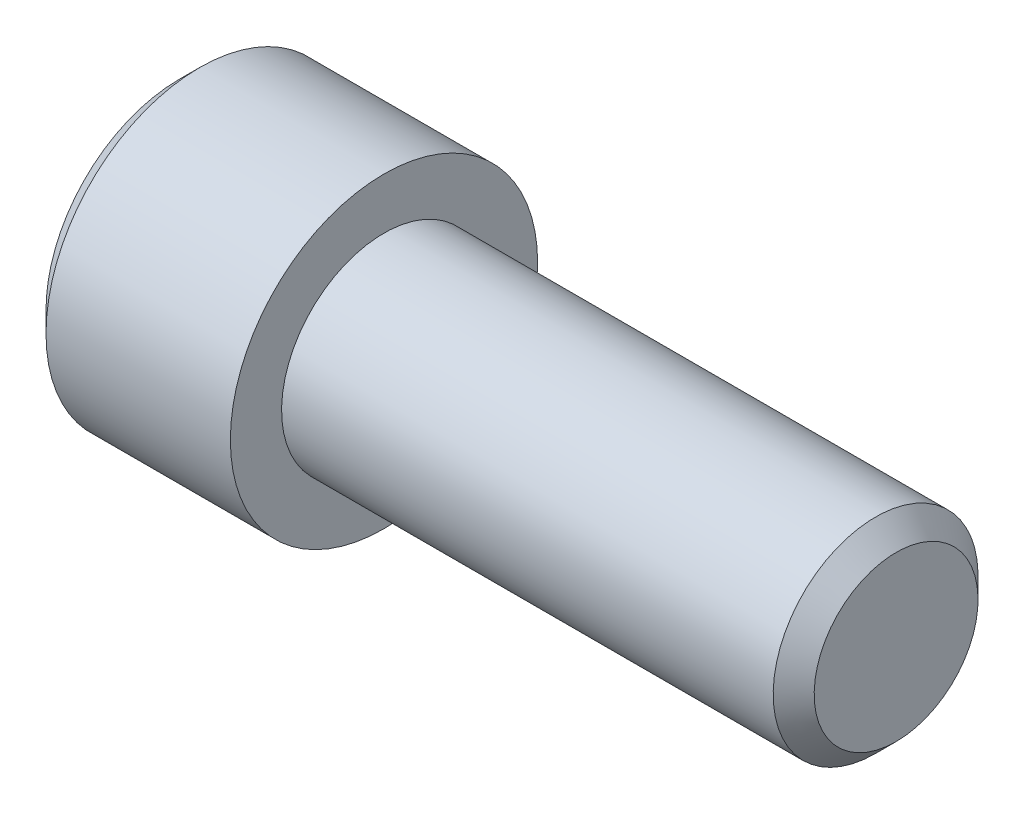
ISO-10303-21;
HEADER;
FILE_DESCRIPTION(('STEP AP214'),'2;1');
FILE_NAME('part.step','',(''),(''),'','','');
FILE_SCHEMA(('AUTOMOTIVE_DESIGN { 1 0 10303 214 1 1 1 1 }'));
ENDSEC;
DATA;
#1=APPLICATION_CONTEXT('core data for automotive mechanical design processes');
#2=APPLICATION_PROTOCOL_DEFINITION('international standard','automotive_design',2000,#1);
#3=PRODUCT_CONTEXT('',#1,'mechanical');
#4=PRODUCT('Part','Part','',(#3));
#5=PRODUCT_RELATED_PRODUCT_CATEGORY('part','',(#4));
#6=PRODUCT_DEFINITION_FORMATION('','',#4);
#7=PRODUCT_DEFINITION_CONTEXT('part definition',#1,'design');
#8=PRODUCT_DEFINITION('design','',#6,#7);
#9=PRODUCT_DEFINITION_SHAPE('','',#8);
#10=(LENGTH_UNIT() NAMED_UNIT(*) SI_UNIT(.MILLI.,.METRE.));
#11=(NAMED_UNIT(*) PLANE_ANGLE_UNIT() SI_UNIT($,.RADIAN.));
#12=(NAMED_UNIT(*) SI_UNIT($,.STERADIAN.) SOLID_ANGLE_UNIT());
#13=UNCERTAINTY_MEASURE_WITH_UNIT(LENGTH_MEASURE(1.E-05),#10,'distance_accuracy_value','');
#14=(GEOMETRIC_REPRESENTATION_CONTEXT(3) GLOBAL_UNCERTAINTY_ASSIGNED_CONTEXT((#13)) GLOBAL_UNIT_ASSIGNED_CONTEXT((#10,
#11,#12)) REPRESENTATION_CONTEXT('',''));
#15=CARTESIAN_POINT('',(0.,0.,0.));
#16=DIRECTION('',(0.,0.,1.));
#17=DIRECTION('',(1.,0.,0.));
#18=AXIS2_PLACEMENT_3D('',#15,#16,#17);
#19=CARTESIAN_POINT('',(-12.,0.,0.));
#20=DIRECTION('',(1.,0.,0.));
#21=DIRECTION('',(0.,1.,0.));
#22=AXIS2_PLACEMENT_3D('',#19,#20,#21);
#23=PLANE('',#22);
#24=CARTESIAN_POINT('',(-12.,0.,0.));
#25=DIRECTION('',(1.,0.,0.));
#26=DIRECTION('',(0.,1.,0.));
#27=AXIS2_PLACEMENT_3D('',#24,#25,#26);
#28=CIRCLE('',#27,7.8);
#29=CARTESIAN_POINT('',(-12.,7.8,0.));
#30=VERTEX_POINT('',#29);
#31=EDGE_CURVE('E44',#30,#30,#28,.F.);
#32=ORIENTED_EDGE('',*,*,#31,.T.);
#33=EDGE_LOOP('',(#32));
#34=FACE_BOUND('',#33,.T.);
#35=DIRECTION('',(0.,0.500000000000001,0.866025403784438));
#36=VECTOR('',#35,1.);
#37=CARTESIAN_POINT('',(-12.,-5.7735026918963,0.));
#38=LINE('',#37,#36);
#39=CARTESIAN_POINT('',(-12.,-5.7735026918963,0.));
#40=VERTEX_POINT('',#39);
#41=CARTESIAN_POINT('',(-12.,-2.88675134594814,5.00000000000004));
#42=VERTEX_POINT('',#41);
#43=EDGE_CURVE('E124',#40,#42,#38,.T.);
#44=ORIENTED_EDGE('',*,*,#43,.F.);
#45=DIRECTION('',(0.,-0.499999999999995,0.866025403784441));
#46=VECTOR('',#45,1.);
#47=CARTESIAN_POINT('',(-12.,-2.88675134594821,-5.));
#48=LINE('',#47,#46);
#49=CARTESIAN_POINT('',(-12.,-2.88675134594821,-5.));
#50=VERTEX_POINT('',#49);
#51=EDGE_CURVE('E51',#50,#40,#48,.T.);
#52=ORIENTED_EDGE('',*,*,#51,.F.);
#53=DIRECTION('',(0.,-1.,0.));
#54=VECTOR('',#53,1.);
#55=CARTESIAN_POINT('',(-12.,2.8867513459481,-5.00000000000006));
#56=LINE('',#55,#54);
#57=CARTESIAN_POINT('',(-12.,2.8867513459481,-5.00000000000006));
#58=VERTEX_POINT('',#57);
#59=EDGE_CURVE('E110',#58,#50,#56,.T.);
#60=ORIENTED_EDGE('',*,*,#59,.F.);
#61=DIRECTION('',(0.,-0.500000000000007,-0.866025403784435));
#62=VECTOR('',#61,1.);
#63=CARTESIAN_POINT('',(-12.,5.7735026918963,0.));
#64=LINE('',#63,#62);
#65=CARTESIAN_POINT('',(-12.,5.7735026918963,0.));
#66=VERTEX_POINT('',#65);
#67=EDGE_CURVE('E113',#66,#58,#64,.T.);
#68=ORIENTED_EDGE('',*,*,#67,.F.);
#69=DIRECTION('',(0.,0.499999999999995,-0.866025403784441));
#70=VECTOR('',#69,1.);
#71=CARTESIAN_POINT('',(-12.,2.88675134594817,5.00000000000002));
#72=LINE('',#71,#70);
#73=CARTESIAN_POINT('',(-12.,2.88675134594817,5.00000000000002));
#74=VERTEX_POINT('',#73);
#75=EDGE_CURVE('E129',#74,#66,#72,.T.);
#76=ORIENTED_EDGE('',*,*,#75,.F.);
#77=DIRECTION('',(0.,1.,0.));
#78=VECTOR('',#77,1.);
#79=CARTESIAN_POINT('',(-12.,-2.88675134594814,5.00000000000004));
#80=LINE('',#79,#78);
#81=EDGE_CURVE('E126',#42,#74,#80,.T.);
#82=ORIENTED_EDGE('',*,*,#81,.F.);
#83=EDGE_LOOP('',(#44,#52,#60,#68,#76,#82));
#84=FACE_BOUND('',#83,.T.);
#85=ADVANCED_FACE('F36',(#34,#84),#23,.F.);
#86=CARTESIAN_POINT('',(30.,0.,0.));
#87=DIRECTION('',(-1.,0.,0.));
#88=DIRECTION('',(0.,-1.,0.));
#89=AXIS2_PLACEMENT_3D('',#86,#87,#88);
#90=CYLINDRICAL_SURFACE('',#89,9.);
#91=CARTESIAN_POINT('',(-10.8,0.,0.));
#92=DIRECTION('',(1.,0.,0.));
#93=DIRECTION('',(0.,1.,0.));
#94=AXIS2_PLACEMENT_3D('',#91,#92,#93);
#95=CIRCLE('',#94,9.);
#96=CARTESIAN_POINT('',(-10.8,9.,0.));
#97=VERTEX_POINT('',#96);
#98=EDGE_CURVE('E11',#97,#97,#95,.T.);
#99=ORIENTED_EDGE('',*,*,#98,.T.);
#100=EDGE_LOOP('',(#99));
#101=FACE_BOUND('',#100,.T.);
#102=CARTESIAN_POINT('',(0.,0.,0.));
#103=DIRECTION('',(-1.,0.,0.));
#104=DIRECTION('',(0.,-1.,0.));
#105=AXIS2_PLACEMENT_3D('',#102,#103,#104);
#106=CIRCLE('',#105,9.);
#107=CARTESIAN_POINT('',(0.,-9.,0.));
#108=VERTEX_POINT('',#107);
#109=EDGE_CURVE('E149',#108,#108,#106,.T.);
#110=ORIENTED_EDGE('',*,*,#109,.T.);
#111=EDGE_LOOP('',(#110));
#112=FACE_BOUND('',#111,.T.);
#113=ADVANCED_FACE('F172',(#101,#112),#90,.T.);
#114=CARTESIAN_POINT('',(0.,9.,0.));
#115=DIRECTION('',(-1.,0.,0.));
#116=DIRECTION('',(0.,-1.,0.));
#117=AXIS2_PLACEMENT_3D('',#114,#115,#116);
#118=PLANE('',#117);
#119=ORIENTED_EDGE('',*,*,#109,.F.);
#120=EDGE_LOOP('',(#119));
#121=FACE_BOUND('',#120,.T.);
#122=CARTESIAN_POINT('',(0.,0.,0.));
#123=DIRECTION('',(-1.,0.,0.));
#124=DIRECTION('',(0.,-1.,0.));
#125=AXIS2_PLACEMENT_3D('',#122,#123,#124);
#126=CIRCLE('',#125,6.);
#127=CARTESIAN_POINT('',(0.,-6.,0.));
#128=VERTEX_POINT('',#127);
#129=EDGE_CURVE('E146',#128,#128,#126,.T.);
#130=ORIENTED_EDGE('',*,*,#129,.T.);
#131=EDGE_LOOP('',(#130));
#132=FACE_BOUND('',#131,.T.);
#133=ADVANCED_FACE('F177',(#121,#132),#118,.F.);
#134=CARTESIAN_POINT('',(30.,0.,0.));
#135=DIRECTION('',(-1.,0.,0.));
#136=DIRECTION('',(0.,-1.,0.));
#137=AXIS2_PLACEMENT_3D('',#134,#135,#136);
#138=CYLINDRICAL_SURFACE('',#137,6.);
#139=CARTESIAN_POINT('',(28.8,0.,0.));
#140=DIRECTION('',(-1.,0.,0.));
#141=DIRECTION('',(0.,-1.,0.));
#142=AXIS2_PLACEMENT_3D('',#139,#140,#141);
#143=CIRCLE('',#142,6.);
#144=CARTESIAN_POINT('',(28.8,-6.00000000000001,0.));
#145=VERTEX_POINT('',#144);
#146=EDGE_CURVE('E152',#145,#145,#143,.T.);
#147=ORIENTED_EDGE('',*,*,#146,.T.);
#148=EDGE_LOOP('',(#147));
#149=FACE_BOUND('',#148,.T.);
#150=ORIENTED_EDGE('',*,*,#129,.F.);
#151=EDGE_LOOP('',(#150));
#152=FACE_BOUND('',#151,.T.);
#153=ADVANCED_FACE('F183',(#149,#152),#138,.T.);
#154=CARTESIAN_POINT('',(30.,6.,0.));
#155=DIRECTION('',(-1.,0.,0.));
#156=DIRECTION('',(0.,-1.,0.));
#157=AXIS2_PLACEMENT_3D('',#154,#155,#156);
#158=PLANE('',#157);
#159=CARTESIAN_POINT('',(30.,0.,0.));
#160=DIRECTION('',(-1.,0.,0.));
#161=DIRECTION('',(0.,-1.,0.));
#162=AXIS2_PLACEMENT_3D('',#159,#160,#161);
#163=CIRCLE('',#162,4.8);
#164=CARTESIAN_POINT('',(30.,-4.8,0.));
#165=VERTEX_POINT('',#164);
#166=EDGE_CURVE('E155',#165,#165,#163,.F.);
#167=ORIENTED_EDGE('',*,*,#166,.T.);
#168=EDGE_LOOP('',(#167));
#169=FACE_BOUND('',#168,.T.);
#170=ADVANCED_FACE('F187',(#169),#158,.F.);
#171=CARTESIAN_POINT('',(-6.,-2.88675134594821,-5.));
#172=DIRECTION('',(0.,-0.866025403784441,-0.499999999999995));
#173=DIRECTION('',(0.,0.499999999999995,-0.866025403784442));
#174=AXIS2_PLACEMENT_3D('',#171,#172,#173);
#175=PLANE('',#174);
#176=ORIENTED_EDGE('',*,*,#51,.T.);
#177=DIRECTION('',(-1.,0.,0.));
#178=VECTOR('',#177,1.);
#179=CARTESIAN_POINT('',(-6.,-5.7735026918963,0.));
#180=LINE('',#179,#178);
#181=CARTESIAN_POINT('',(-6.,-5.7735026918963,0.));
#182=VERTEX_POINT('',#181);
#183=EDGE_CURVE('E87',#182,#40,#180,.T.);
#184=ORIENTED_EDGE('',*,*,#183,.F.);
#185=DIRECTION('',(0.,-0.499999999999995,0.866025403784441));
#186=VECTOR('',#185,1.);
#187=CARTESIAN_POINT('',(-6.,-2.88675134594821,-5.));
#188=LINE('',#187,#186);
#189=CARTESIAN_POINT('',(-6.,-2.88675134594821,-5.));
#190=VERTEX_POINT('',#189);
#191=EDGE_CURVE('E91',#190,#182,#188,.T.);
#192=ORIENTED_EDGE('',*,*,#191,.F.);
#193=DIRECTION('',(-1.,0.,0.));
#194=VECTOR('',#193,1.);
#195=CARTESIAN_POINT('',(-6.,-2.88675134594821,-5.));
#196=LINE('',#195,#194);
#197=EDGE_CURVE('E134',#190,#50,#196,.T.);
#198=ORIENTED_EDGE('',*,*,#197,.T.);
#199=EDGE_LOOP('',(#176,#184,#192,#198));
#200=FACE_BOUND('',#199,.T.);
#201=ADVANCED_FACE('F89',(#200),#175,.F.);
#202=CARTESIAN_POINT('',(-6.,2.8867513459481,-5.00000000000006));
#203=DIRECTION('',(0.,0.,-1.));
#204=DIRECTION('',(0.,1.,0.));
#205=AXIS2_PLACEMENT_3D('',#202,#203,#204);
#206=PLANE('',#205);
#207=ORIENTED_EDGE('',*,*,#59,.T.);
#208=ORIENTED_EDGE('',*,*,#197,.F.);
#209=DIRECTION('',(0.,-1.,0.));
#210=VECTOR('',#209,1.);
#211=CARTESIAN_POINT('',(-6.,2.8867513459481,-5.00000000000006));
#212=LINE('',#211,#210);
#213=CARTESIAN_POINT('',(-6.,2.8867513459481,-5.00000000000006));
#214=VERTEX_POINT('',#213);
#215=EDGE_CURVE('E97',#214,#190,#212,.T.);
#216=ORIENTED_EDGE('',*,*,#215,.F.);
#217=DIRECTION('',(-1.,0.,0.));
#218=VECTOR('',#217,1.);
#219=CARTESIAN_POINT('',(-6.,2.8867513459481,-5.00000000000006));
#220=LINE('',#219,#218);
#221=EDGE_CURVE('E137',#214,#58,#220,.T.);
#222=ORIENTED_EDGE('',*,*,#221,.T.);
#223=EDGE_LOOP('',(#207,#208,#216,#222));
#224=FACE_BOUND('',#223,.T.);
#225=ADVANCED_FACE('F197',(#224),#206,.F.);
#226=CARTESIAN_POINT('',(-6.,5.7735026918963,0.));
#227=DIRECTION('',(0.,0.866025403784435,-0.500000000000007));
#228=DIRECTION('',(0.,0.500000000000007,0.866025403784434));
#229=AXIS2_PLACEMENT_3D('',#226,#227,#228);
#230=PLANE('',#229);
#231=ORIENTED_EDGE('',*,*,#67,.T.);
#232=ORIENTED_EDGE('',*,*,#221,.F.);
#233=DIRECTION('',(0.,-0.500000000000007,-0.866025403784435));
#234=VECTOR('',#233,1.);
#235=CARTESIAN_POINT('',(-6.,5.7735026918963,0.));
#236=LINE('',#235,#234);
#237=CARTESIAN_POINT('',(-6.,5.7735026918963,0.));
#238=VERTEX_POINT('',#237);
#239=EDGE_CURVE('E120',#238,#214,#236,.T.);
#240=ORIENTED_EDGE('',*,*,#239,.F.);
#241=DIRECTION('',(-1.,0.,0.));
#242=VECTOR('',#241,1.);
#243=CARTESIAN_POINT('',(-6.,5.7735026918963,0.));
#244=LINE('',#243,#242);
#245=EDGE_CURVE('E139',#238,#66,#244,.T.);
#246=ORIENTED_EDGE('',*,*,#245,.T.);
#247=EDGE_LOOP('',(#231,#232,#240,#246));
#248=FACE_BOUND('',#247,.T.);
#249=ADVANCED_FACE('F207',(#248),#230,.F.);
#250=CARTESIAN_POINT('',(-6.,2.88675134594817,5.00000000000002));
#251=DIRECTION('',(0.,0.866025403784442,0.499999999999995));
#252=DIRECTION('',(0.,-0.499999999999995,0.866025403784442));
#253=AXIS2_PLACEMENT_3D('',#250,#251,#252);
#254=PLANE('',#253);
#255=ORIENTED_EDGE('',*,*,#75,.T.);
#256=ORIENTED_EDGE('',*,*,#245,.F.);
#257=DIRECTION('',(0.,0.499999999999995,-0.866025403784441));
#258=VECTOR('',#257,1.);
#259=CARTESIAN_POINT('',(-6.,2.88675134594817,5.00000000000002));
#260=LINE('',#259,#258);
#261=CARTESIAN_POINT('',(-6.,2.88675134594817,5.00000000000002));
#262=VERTEX_POINT('',#261);
#263=EDGE_CURVE('E117',#262,#238,#260,.T.);
#264=ORIENTED_EDGE('',*,*,#263,.F.);
#265=DIRECTION('',(-1.,0.,0.));
#266=VECTOR('',#265,1.);
#267=CARTESIAN_POINT('',(-6.,2.88675134594817,5.00000000000002));
#268=LINE('',#267,#266);
#269=EDGE_CURVE('E141',#262,#74,#268,.T.);
#270=ORIENTED_EDGE('',*,*,#269,.T.);
#271=EDGE_LOOP('',(#255,#256,#264,#270));
#272=FACE_BOUND('',#271,.T.);
#273=ADVANCED_FACE('F203',(#272),#254,.F.);
#274=CARTESIAN_POINT('',(-6.,-2.88675134594814,5.00000000000004));
#275=DIRECTION('',(0.,0.,1.));
#276=DIRECTION('',(0.,-1.,0.));
#277=AXIS2_PLACEMENT_3D('',#274,#275,#276);
#278=PLANE('',#277);
#279=ORIENTED_EDGE('',*,*,#81,.T.);
#280=ORIENTED_EDGE('',*,*,#269,.F.);
#281=DIRECTION('',(0.,1.,0.));
#282=VECTOR('',#281,1.);
#283=CARTESIAN_POINT('',(-6.,-2.88675134594814,5.00000000000004));
#284=LINE('',#283,#282);
#285=CARTESIAN_POINT('',(-6.,-2.88675134594814,5.00000000000004));
#286=VERTEX_POINT('',#285);
#287=EDGE_CURVE('E105',#286,#262,#284,.T.);
#288=ORIENTED_EDGE('',*,*,#287,.F.);
#289=DIRECTION('',(-1.,0.,0.));
#290=VECTOR('',#289,1.);
#291=CARTESIAN_POINT('',(-6.,-2.88675134594814,5.00000000000004));
#292=LINE('',#291,#290);
#293=EDGE_CURVE('E96',#286,#42,#292,.T.);
#294=ORIENTED_EDGE('',*,*,#293,.T.);
#295=EDGE_LOOP('',(#279,#280,#288,#294));
#296=FACE_BOUND('',#295,.T.);
#297=ADVANCED_FACE('F200',(#296),#278,.F.);
#298=CARTESIAN_POINT('',(-6.,-5.7735026918963,0.));
#299=DIRECTION('',(0.,-0.866025403784438,0.500000000000001));
#300=DIRECTION('',(0.,-0.500000000000001,-0.866025403784438));
#301=AXIS2_PLACEMENT_3D('',#298,#299,#300);
#302=PLANE('',#301);
#303=ORIENTED_EDGE('',*,*,#43,.T.);
#304=ORIENTED_EDGE('',*,*,#293,.F.);
#305=DIRECTION('',(0.,0.500000000000001,0.866025403784438));
#306=VECTOR('',#305,1.);
#307=CARTESIAN_POINT('',(-6.,-5.7735026918963,0.));
#308=LINE('',#307,#306);
#309=EDGE_CURVE('E100',#182,#286,#308,.T.);
#310=ORIENTED_EDGE('',*,*,#309,.F.);
#311=ORIENTED_EDGE('',*,*,#183,.T.);
#312=EDGE_LOOP('',(#303,#304,#310,#311));
#313=FACE_BOUND('',#312,.T.);
#314=ADVANCED_FACE('F101',(#313),#302,.F.);
#315=CARTESIAN_POINT('',(-6.,-5.7735026918963,0.));
#316=DIRECTION('',(-1.,0.,0.));
#317=DIRECTION('',(0.,0.,1.));
#318=AXIS2_PLACEMENT_3D('',#315,#316,#317);
#319=PLANE('',#318);
#320=CARTESIAN_POINT('',(-6.,0.,0.));
#321=DIRECTION('',(-1.,0.,0.));
#322=DIRECTION('',(0.,0.,1.));
#323=AXIS2_PLACEMENT_3D('',#320,#321,#322);
#324=CIRCLE('',#323,4.995);
#325=CARTESIAN_POINT('',(-6.,0.,4.995));
#326=VERTEX_POINT('',#325);
#327=EDGE_CURVE('E136',#326,#326,#324,.T.);
#328=ORIENTED_EDGE('',*,*,#327,.F.);
#329=EDGE_LOOP('',(#328));
#330=FACE_BOUND('',#329,.T.);
#331=ORIENTED_EDGE('',*,*,#191,.T.);
#332=ORIENTED_EDGE('',*,*,#309,.T.);
#333=ORIENTED_EDGE('',*,*,#287,.T.);
#334=ORIENTED_EDGE('',*,*,#263,.T.);
#335=ORIENTED_EDGE('',*,*,#239,.T.);
#336=ORIENTED_EDGE('',*,*,#215,.T.);
#337=EDGE_LOOP('',(#331,#332,#333,#334,#335,#336));
#338=FACE_BOUND('',#337,.T.);
#339=ADVANCED_FACE('F107',(#330,#338),#319,.T.);
#340=CARTESIAN_POINT('',(-4.66159378380652,0.,0.));
#341=DIRECTION('',(-1.,0.,0.));
#342=DIRECTION('',(0.,0.,1.));
#343=AXIS2_PLACEMENT_3D('',#340,#341,#342);
#344=CONICAL_SURFACE('',#343,0.,1.30899693899574);
#345=ORIENTED_EDGE('',*,*,#327,.T.);
#346=EDGE_LOOP('',(#345));
#347=FACE_BOUND('',#346,.T.);
#348=CARTESIAN_POINT('',(-4.66159378380652,0.,0.));
#349=VERTEX_POINT('',#348);
#350=VERTEX_LOOP('',#349);
#351=FACE_BOUND('',#350,.T.);
#352=ADVANCED_FACE('F168',(#347,#351),#344,.F.);
#353=CARTESIAN_POINT('',(28.8,0.,0.));
#354=DIRECTION('',(-1.,0.,0.));
#355=DIRECTION('',(0.,-1.,0.));
#356=AXIS2_PLACEMENT_3D('',#353,#354,#355);
#357=CONICAL_SURFACE('',#356,6.,0.785398163397448);
#358=ORIENTED_EDGE('',*,*,#166,.F.);
#359=EDGE_LOOP('',(#358));
#360=FACE_BOUND('',#359,.T.);
#361=ORIENTED_EDGE('',*,*,#146,.F.);
#362=EDGE_LOOP('',(#361));
#363=FACE_BOUND('',#362,.T.);
#364=ADVANCED_FACE('F163',(#360,#363),#357,.T.);
#365=CARTESIAN_POINT('',(-12.,0.,0.));
#366=DIRECTION('',(1.,0.,0.));
#367=DIRECTION('',(0.,1.,0.));
#368=AXIS2_PLACEMENT_3D('',#365,#366,#367);
#369=CONICAL_SURFACE('',#368,7.8,0.785398163397449);
#370=ORIENTED_EDGE('',*,*,#98,.F.);
#371=EDGE_LOOP('',(#370));
#372=FACE_BOUND('',#371,.T.);
#373=ORIENTED_EDGE('',*,*,#31,.F.);
#374=EDGE_LOOP('',(#373));
#375=FACE_BOUND('',#374,.T.);
#376=ADVANCED_FACE('F38',(#372,#375),#369,.T.);
#377=CLOSED_SHELL('',(#85,#113,#133,#153,#170,#201,#225,#249,#273,#297,#314,#339,#352,#364,#376));
#378=MANIFOLD_SOLID_BREP('B2',#377);
#379=ADVANCED_BREP_SHAPE_REPRESENTATION('',(#18,#378),#14);
#380=SHAPE_DEFINITION_REPRESENTATION(#9,#379);
ENDSEC;
END-ISO-10303-21;
